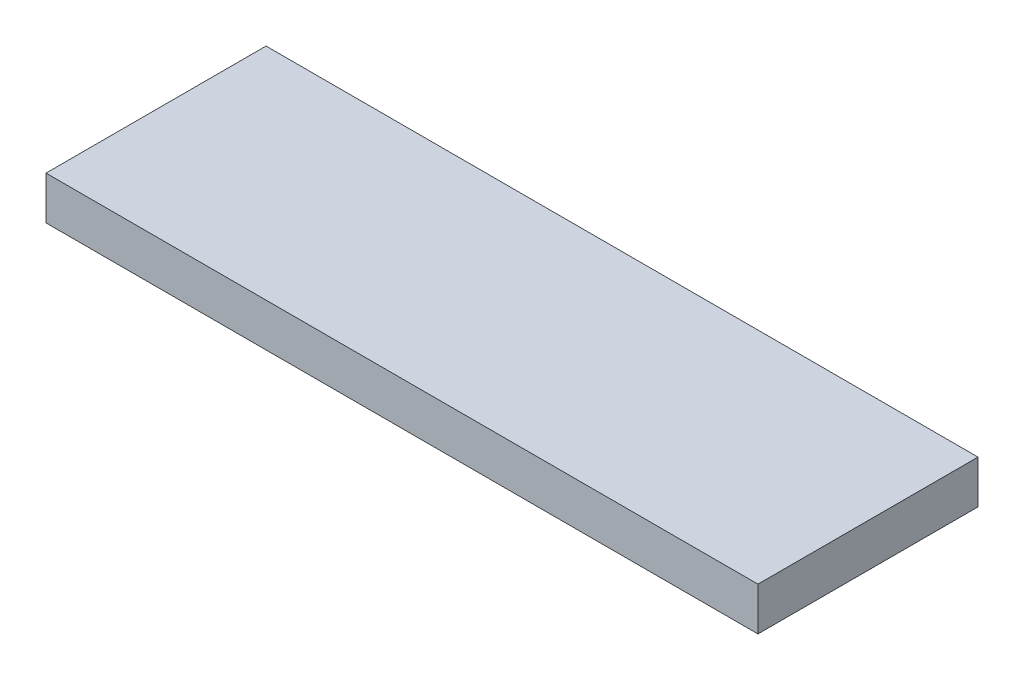
ISO-10303-21;
HEADER;
FILE_DESCRIPTION(('STEP AP214'),'2;1');
FILE_NAME('part.step','',(''),(''),'','','');
FILE_SCHEMA(('AUTOMOTIVE_DESIGN { 1 0 10303 214 1 1 1 1 }'));
ENDSEC;
DATA;
#1=APPLICATION_CONTEXT('core data for automotive mechanical design processes');
#2=APPLICATION_PROTOCOL_DEFINITION('international standard','automotive_design',2000,#1);
#3=PRODUCT_CONTEXT('',#1,'mechanical');
#4=PRODUCT('Part','Part','',(#3));
#5=PRODUCT_RELATED_PRODUCT_CATEGORY('part','',(#4));
#6=PRODUCT_DEFINITION_FORMATION('','',#4);
#7=PRODUCT_DEFINITION_CONTEXT('part definition',#1,'design');
#8=PRODUCT_DEFINITION('design','',#6,#7);
#9=PRODUCT_DEFINITION_SHAPE('','',#8);
#10=(LENGTH_UNIT() NAMED_UNIT(*) SI_UNIT(.MILLI.,.METRE.));
#11=(NAMED_UNIT(*) PLANE_ANGLE_UNIT() SI_UNIT($,.RADIAN.));
#12=(NAMED_UNIT(*) SI_UNIT($,.STERADIAN.) SOLID_ANGLE_UNIT());
#13=UNCERTAINTY_MEASURE_WITH_UNIT(LENGTH_MEASURE(1.E-05),#10,'distance_accuracy_value','');
#14=(GEOMETRIC_REPRESENTATION_CONTEXT(3) GLOBAL_UNCERTAINTY_ASSIGNED_CONTEXT((#13)) GLOBAL_UNIT_ASSIGNED_CONTEXT((#10,
#11,#12)) REPRESENTATION_CONTEXT('',''));
#15=CARTESIAN_POINT('',(0.,0.,0.));
#16=DIRECTION('',(0.,0.,1.));
#17=DIRECTION('',(1.,0.,0.));
#18=AXIS2_PLACEMENT_3D('',#15,#16,#17);
#19=CARTESIAN_POINT('',(-55.1822903072853,2.,20.6705725768213));
#20=DIRECTION('',(1.,0.,0.));
#21=DIRECTION('',(0.,0.,-1.));
#22=AXIS2_PLACEMENT_3D('',#19,#20,#21);
#23=PLANE('',#22);
#24=DIRECTION('',(0.,0.,1.));
#25=VECTOR('',#24,1.);
#26=CARTESIAN_POINT('',(-55.1822903072853,-2.,20.6705725768213));
#27=LINE('',#26,#25);
#28=CARTESIAN_POINT('',(-55.1822903072853,-2.,20.6705725768213));
#29=VERTEX_POINT('',#28);
#30=CARTESIAN_POINT('',(-55.1822903072853,-2.,41.0705725768213));
#31=VERTEX_POINT('',#30);
#32=EDGE_CURVE('E96',#29,#31,#27,.T.);
#33=ORIENTED_EDGE('',*,*,#32,.T.);
#34=DIRECTION('',(0.,-1.,0.));
#35=VECTOR('',#34,1.);
#36=CARTESIAN_POINT('',(-55.1822903072853,2.,41.0705725768213));
#37=LINE('',#36,#35);
#38=CARTESIAN_POINT('',(-55.1822903072853,2.,41.0705725768213));
#39=VERTEX_POINT('',#38);
#40=EDGE_CURVE('E11',#39,#31,#37,.T.);
#41=ORIENTED_EDGE('',*,*,#40,.F.);
#42=DIRECTION('',(0.,0.,1.));
#43=VECTOR('',#42,1.);
#44=CARTESIAN_POINT('',(-55.1822903072853,2.,20.6705725768213));
#45=LINE('',#44,#43);
#46=CARTESIAN_POINT('',(-55.1822903072853,2.,20.6705725768213));
#47=VERTEX_POINT('',#46);
#48=EDGE_CURVE('E84',#47,#39,#45,.T.);
#49=ORIENTED_EDGE('',*,*,#48,.F.);
#50=DIRECTION('',(0.,-1.,0.));
#51=VECTOR('',#50,1.);
#52=CARTESIAN_POINT('',(-55.1822903072853,2.,20.6705725768213));
#53=LINE('',#52,#51);
#54=EDGE_CURVE('E92',#47,#29,#53,.T.);
#55=ORIENTED_EDGE('',*,*,#54,.T.);
#56=EDGE_LOOP('',(#33,#41,#49,#55));
#57=FACE_BOUND('',#56,.T.);
#58=ADVANCED_FACE('F33',(#57),#23,.F.);
#59=CARTESIAN_POINT('',(-55.1822903072853,2.,41.0705725768213));
#60=DIRECTION('',(0.,0.,-1.));
#61=DIRECTION('',(-1.,0.,0.));
#62=AXIS2_PLACEMENT_3D('',#59,#60,#61);
#63=PLANE('',#62);
#64=DIRECTION('',(1.,0.,0.));
#65=VECTOR('',#64,1.);
#66=CARTESIAN_POINT('',(-55.1822903072853,-2.,41.0705725768213));
#67=LINE('',#66,#65);
#68=CARTESIAN_POINT('',(10.8177096927147,-2.,41.0705725768213));
#69=VERTEX_POINT('',#68);
#70=EDGE_CURVE('E88',#31,#69,#67,.T.);
#71=ORIENTED_EDGE('',*,*,#70,.T.);
#72=DIRECTION('',(0.,-1.,0.));
#73=VECTOR('',#72,1.);
#74=CARTESIAN_POINT('',(10.8177096927147,2.,41.0705725768213));
#75=LINE('',#74,#73);
#76=CARTESIAN_POINT('',(10.8177096927147,2.,41.0705725768213));
#77=VERTEX_POINT('',#76);
#78=EDGE_CURVE('E41',#77,#69,#75,.T.);
#79=ORIENTED_EDGE('',*,*,#78,.F.);
#80=DIRECTION('',(1.,0.,0.));
#81=VECTOR('',#80,1.);
#82=CARTESIAN_POINT('',(-55.1822903072853,2.,41.0705725768213));
#83=LINE('',#82,#81);
#84=EDGE_CURVE('E79',#39,#77,#83,.T.);
#85=ORIENTED_EDGE('',*,*,#84,.F.);
#86=ORIENTED_EDGE('',*,*,#40,.T.);
#87=EDGE_LOOP('',(#71,#79,#85,#86));
#88=FACE_BOUND('',#87,.T.);
#89=ADVANCED_FACE('F87',(#88),#63,.F.);
#90=CARTESIAN_POINT('',(10.8177096927147,2.,20.6705725768213));
#91=DIRECTION('',(-1.,0.,0.));
#92=DIRECTION('',(0.,0.,1.));
#93=AXIS2_PLACEMENT_3D('',#90,#91,#92);
#94=PLANE('',#93);
#95=DIRECTION('',(0.,0.,-1.));
#96=VECTOR('',#95,1.);
#97=CARTESIAN_POINT('',(10.8177096927147,-2.,20.6705725768213));
#98=LINE('',#97,#96);
#99=CARTESIAN_POINT('',(10.8177096927147,-2.,20.6705725768213));
#100=VERTEX_POINT('',#99);
#101=EDGE_CURVE('E66',#69,#100,#98,.T.);
#102=ORIENTED_EDGE('',*,*,#101,.T.);
#103=DIRECTION('',(0.,-1.,0.));
#104=VECTOR('',#103,1.);
#105=CARTESIAN_POINT('',(10.8177096927147,2.,20.6705725768213));
#106=LINE('',#105,#104);
#107=CARTESIAN_POINT('',(10.8177096927147,2.,20.6705725768213));
#108=VERTEX_POINT('',#107);
#109=EDGE_CURVE('E89',#108,#100,#106,.T.);
#110=ORIENTED_EDGE('',*,*,#109,.F.);
#111=DIRECTION('',(0.,0.,-1.));
#112=VECTOR('',#111,1.);
#113=CARTESIAN_POINT('',(10.8177096927147,2.,20.6705725768213));
#114=LINE('',#113,#112);
#115=EDGE_CURVE('E82',#77,#108,#114,.T.);
#116=ORIENTED_EDGE('',*,*,#115,.F.);
#117=ORIENTED_EDGE('',*,*,#78,.T.);
#118=EDGE_LOOP('',(#102,#110,#116,#117));
#119=FACE_BOUND('',#118,.T.);
#120=ADVANCED_FACE('F90',(#119),#94,.F.);
#121=CARTESIAN_POINT('',(-55.1822903072853,2.,20.6705725768213));
#122=DIRECTION('',(0.,0.,1.));
#123=DIRECTION('',(1.,0.,0.));
#124=AXIS2_PLACEMENT_3D('',#121,#122,#123);
#125=PLANE('',#124);
#126=DIRECTION('',(-1.,0.,0.));
#127=VECTOR('',#126,1.);
#128=CARTESIAN_POINT('',(-55.1822903072853,-2.,20.6705725768213));
#129=LINE('',#128,#127);
#130=EDGE_CURVE('E72',#100,#29,#129,.T.);
#131=ORIENTED_EDGE('',*,*,#130,.T.);
#132=ORIENTED_EDGE('',*,*,#54,.F.);
#133=DIRECTION('',(-1.,0.,0.));
#134=VECTOR('',#133,1.);
#135=CARTESIAN_POINT('',(-55.1822903072853,2.,20.6705725768213));
#136=LINE('',#135,#134);
#137=EDGE_CURVE('E49',#108,#47,#136,.T.);
#138=ORIENTED_EDGE('',*,*,#137,.F.);
#139=ORIENTED_EDGE('',*,*,#109,.T.);
#140=EDGE_LOOP('',(#131,#132,#138,#139));
#141=FACE_BOUND('',#140,.T.);
#142=ADVANCED_FACE('F103',(#141),#125,.F.);
#143=CARTESIAN_POINT('',(0.,2.,0.));
#144=DIRECTION('',(0.,1.,0.));
#145=DIRECTION('',(0.,0.,1.));
#146=AXIS2_PLACEMENT_3D('',#143,#144,#145);
#147=PLANE('',#146);
#148=ORIENTED_EDGE('',*,*,#48,.T.);
#149=ORIENTED_EDGE('',*,*,#84,.T.);
#150=ORIENTED_EDGE('',*,*,#115,.T.);
#151=ORIENTED_EDGE('',*,*,#137,.T.);
#152=EDGE_LOOP('',(#148,#149,#150,#151));
#153=FACE_BOUND('',#152,.T.);
#154=ADVANCED_FACE('F80',(#153),#147,.T.);
#155=CARTESIAN_POINT('',(0.,-2.,0.));
#156=DIRECTION('',(0.,1.,0.));
#157=DIRECTION('',(0.,0.,1.));
#158=AXIS2_PLACEMENT_3D('',#155,#156,#157);
#159=PLANE('',#158);
#160=ORIENTED_EDGE('',*,*,#32,.F.);
#161=ORIENTED_EDGE('',*,*,#130,.F.);
#162=ORIENTED_EDGE('',*,*,#101,.F.);
#163=ORIENTED_EDGE('',*,*,#70,.F.);
#164=EDGE_LOOP('',(#160,#161,#162,#163));
#165=FACE_BOUND('',#164,.T.);
#166=ADVANCED_FACE('F106',(#165),#159,.F.);
#167=CLOSED_SHELL('',(#58,#89,#120,#142,#154,#166));
#168=MANIFOLD_SOLID_BREP('B2',#167);
#169=ADVANCED_BREP_SHAPE_REPRESENTATION('',(#18,#168),#14);
#170=SHAPE_DEFINITION_REPRESENTATION(#9,#169);
ENDSEC;
END-ISO-10303-21;
